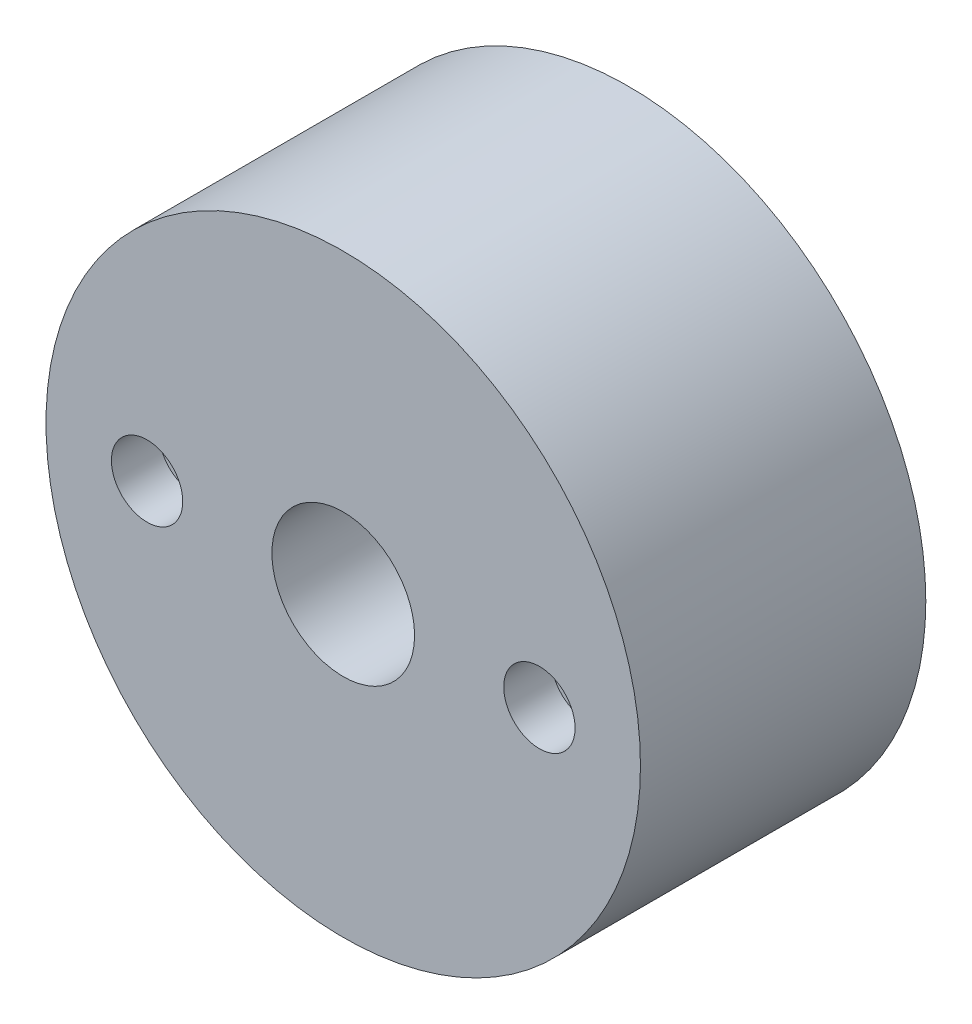
ISO-10303-21;
HEADER;
FILE_DESCRIPTION(('STEP AP214'),'2;1');
FILE_NAME('part.step','',(''),(''),'','','');
FILE_SCHEMA(('AUTOMOTIVE_DESIGN { 1 0 10303 214 1 1 1 1 }'));
ENDSEC;
DATA;
#1=APPLICATION_CONTEXT('core data for automotive mechanical design processes');
#2=APPLICATION_PROTOCOL_DEFINITION('international standard','automotive_design',2000,#1);
#3=PRODUCT_CONTEXT('',#1,'mechanical');
#4=PRODUCT('Part','Part','',(#3));
#5=PRODUCT_RELATED_PRODUCT_CATEGORY('part','',(#4));
#6=PRODUCT_DEFINITION_FORMATION('','',#4);
#7=PRODUCT_DEFINITION_CONTEXT('part definition',#1,'design');
#8=PRODUCT_DEFINITION('design','',#6,#7);
#9=PRODUCT_DEFINITION_SHAPE('','',#8);
#10=(LENGTH_UNIT() NAMED_UNIT(*) SI_UNIT(.MILLI.,.METRE.));
#11=(NAMED_UNIT(*) PLANE_ANGLE_UNIT() SI_UNIT($,.RADIAN.));
#12=(NAMED_UNIT(*) SI_UNIT($,.STERADIAN.) SOLID_ANGLE_UNIT());
#13=UNCERTAINTY_MEASURE_WITH_UNIT(LENGTH_MEASURE(1.E-05),#10,'distance_accuracy_value','');
#14=(GEOMETRIC_REPRESENTATION_CONTEXT(3) GLOBAL_UNCERTAINTY_ASSIGNED_CONTEXT((#13)) GLOBAL_UNIT_ASSIGNED_CONTEXT((#10,
#11,#12)) REPRESENTATION_CONTEXT('',''));
#15=CARTESIAN_POINT('',(0.,0.,0.));
#16=DIRECTION('',(0.,0.,1.));
#17=DIRECTION('',(1.,0.,0.));
#18=AXIS2_PLACEMENT_3D('',#15,#16,#17);
#19=CARTESIAN_POINT('',(0.,0.,12.));
#20=DIRECTION('',(0.,0.,-1.));
#21=DIRECTION('',(-1.,0.,0.));
#22=AXIS2_PLACEMENT_3D('',#19,#20,#21);
#23=CYLINDRICAL_SURFACE('',#22,12.5);
#24=CARTESIAN_POINT('',(0.,0.,12.));
#25=DIRECTION('',(0.,0.,1.));
#26=DIRECTION('',(1.,0.,0.));
#27=AXIS2_PLACEMENT_3D('',#24,#25,#26);
#28=CIRCLE('',#27,12.5);
#29=CARTESIAN_POINT('',(12.5,0.,12.));
#30=VERTEX_POINT('',#29);
#31=EDGE_CURVE('E10',#30,#30,#28,.T.);
#32=ORIENTED_EDGE('',*,*,#31,.F.);
#33=EDGE_LOOP('',(#32));
#34=FACE_BOUND('',#33,.T.);
#35=CARTESIAN_POINT('',(0.,0.,0.));
#36=DIRECTION('',(0.,0.,1.));
#37=DIRECTION('',(1.,0.,0.));
#38=AXIS2_PLACEMENT_3D('',#35,#36,#37);
#39=CIRCLE('',#38,12.5);
#40=CARTESIAN_POINT('',(12.5,0.,0.));
#41=VERTEX_POINT('',#40);
#42=EDGE_CURVE('E37',#41,#41,#39,.T.);
#43=ORIENTED_EDGE('',*,*,#42,.T.);
#44=EDGE_LOOP('',(#43));
#45=FACE_BOUND('',#44,.T.);
#46=ADVANCED_FACE('F34',(#34,#45),#23,.T.);
#47=CARTESIAN_POINT('',(0.,0.,12.));
#48=DIRECTION('',(0.,0.,1.));
#49=DIRECTION('',(1.,0.,0.));
#50=AXIS2_PLACEMENT_3D('',#47,#48,#49);
#51=PLANE('',#50);
#52=CARTESIAN_POINT('',(-8.25,0.,12.));
#53=DIRECTION('',(0.,0.,1.));
#54=DIRECTION('',(1.,0.,0.));
#55=AXIS2_PLACEMENT_3D('',#52,#53,#54);
#56=CIRCLE('',#55,1.5);
#57=CARTESIAN_POINT('',(-6.75,0.,12.));
#58=VERTEX_POINT('',#57);
#59=EDGE_CURVE('E58',#58,#58,#56,.T.);
#60=ORIENTED_EDGE('',*,*,#59,.F.);
#61=EDGE_LOOP('',(#60));
#62=FACE_BOUND('',#61,.T.);
#63=CARTESIAN_POINT('',(8.25,0.,12.));
#64=DIRECTION('',(0.,0.,1.));
#65=DIRECTION('',(1.,0.,0.));
#66=AXIS2_PLACEMENT_3D('',#63,#64,#65);
#67=CIRCLE('',#66,1.5);
#68=CARTESIAN_POINT('',(9.75,0.,12.));
#69=VERTEX_POINT('',#68);
#70=EDGE_CURVE('E52',#69,#69,#67,.T.);
#71=ORIENTED_EDGE('',*,*,#70,.F.);
#72=EDGE_LOOP('',(#71));
#73=FACE_BOUND('',#72,.T.);
#74=CARTESIAN_POINT('',(0.,0.,12.));
#75=DIRECTION('',(0.,0.,1.));
#76=DIRECTION('',(1.,0.,0.));
#77=AXIS2_PLACEMENT_3D('',#74,#75,#76);
#78=CIRCLE('',#77,3.);
#79=CARTESIAN_POINT('',(3.,0.,12.));
#80=VERTEX_POINT('',#79);
#81=EDGE_CURVE('E46',#80,#80,#78,.T.);
#82=ORIENTED_EDGE('',*,*,#81,.F.);
#83=EDGE_LOOP('',(#82));
#84=FACE_BOUND('',#83,.T.);
#85=ORIENTED_EDGE('',*,*,#31,.T.);
#86=EDGE_LOOP('',(#85));
#87=FACE_BOUND('',#86,.T.);
#88=ADVANCED_FACE('F73',(#62,#73,#84,#87),#51,.T.);
#89=CARTESIAN_POINT('',(0.,0.,0.));
#90=DIRECTION('',(0.,0.,1.));
#91=DIRECTION('',(1.,0.,0.));
#92=AXIS2_PLACEMENT_3D('',#89,#90,#91);
#93=PLANE('',#92);
#94=CARTESIAN_POINT('',(0.,0.,0.));
#95=DIRECTION('',(0.,0.,1.));
#96=DIRECTION('',(1.,0.,0.));
#97=AXIS2_PLACEMENT_3D('',#94,#95,#96);
#98=CIRCLE('',#97,3.);
#99=CARTESIAN_POINT('',(3.,0.,0.));
#100=VERTEX_POINT('',#99);
#101=EDGE_CURVE('E44',#100,#100,#98,.T.);
#102=ORIENTED_EDGE('',*,*,#101,.T.);
#103=EDGE_LOOP('',(#102));
#104=FACE_BOUND('',#103,.T.);
#105=ORIENTED_EDGE('',*,*,#42,.F.);
#106=EDGE_LOOP('',(#105));
#107=FACE_BOUND('',#106,.T.);
#108=ADVANCED_FACE('F76',(#104,#107),#93,.F.);
#109=CARTESIAN_POINT('',(0.,0.,0.));
#110=DIRECTION('',(0.,0.,1.));
#111=DIRECTION('',(1.,0.,0.));
#112=AXIS2_PLACEMENT_3D('',#109,#110,#111);
#113=CYLINDRICAL_SURFACE('',#112,3.);
#114=ORIENTED_EDGE('',*,*,#101,.F.);
#115=EDGE_LOOP('',(#114));
#116=FACE_BOUND('',#115,.T.);
#117=ORIENTED_EDGE('',*,*,#81,.T.);
#118=EDGE_LOOP('',(#117));
#119=FACE_BOUND('',#118,.T.);
#120=ADVANCED_FACE('F82',(#116,#119),#113,.F.);
#121=CARTESIAN_POINT('',(8.25,0.,10.));
#122=DIRECTION('',(0.,0.,1.));
#123=DIRECTION('',(1.,0.,0.));
#124=AXIS2_PLACEMENT_3D('',#121,#122,#123);
#125=CYLINDRICAL_SURFACE('',#124,1.5);
#126=CARTESIAN_POINT('',(8.25,0.,10.));
#127=DIRECTION('',(0.,0.,1.));
#128=DIRECTION('',(1.,0.,0.));
#129=AXIS2_PLACEMENT_3D('',#126,#127,#128);
#130=CIRCLE('',#129,1.5);
#131=CARTESIAN_POINT('',(9.75,0.,10.));
#132=VERTEX_POINT('',#131);
#133=EDGE_CURVE('E55',#132,#132,#130,.T.);
#134=ORIENTED_EDGE('',*,*,#133,.F.);
#135=EDGE_LOOP('',(#134));
#136=FACE_BOUND('',#135,.T.);
#137=ORIENTED_EDGE('',*,*,#70,.T.);
#138=EDGE_LOOP('',(#137));
#139=FACE_BOUND('',#138,.T.);
#140=ADVANCED_FACE('F84',(#136,#139),#125,.F.);
#141=CARTESIAN_POINT('',(8.25,0.,10.));
#142=DIRECTION('',(0.,0.,1.));
#143=DIRECTION('',(1.,0.,0.));
#144=AXIS2_PLACEMENT_3D('',#141,#142,#143);
#145=PLANE('',#144);
#146=ORIENTED_EDGE('',*,*,#133,.T.);
#147=EDGE_LOOP('',(#146));
#148=FACE_BOUND('',#147,.T.);
#149=ADVANCED_FACE('F69',(#148),#145,.T.);
#150=CARTESIAN_POINT('',(-8.25,0.,10.));
#151=DIRECTION('',(0.,0.,1.));
#152=DIRECTION('',(1.,0.,0.));
#153=AXIS2_PLACEMENT_3D('',#150,#151,#152);
#154=CYLINDRICAL_SURFACE('',#153,1.5);
#155=CARTESIAN_POINT('',(-8.25,0.,10.));
#156=DIRECTION('',(0.,0.,1.));
#157=DIRECTION('',(1.,0.,0.));
#158=AXIS2_PLACEMENT_3D('',#155,#156,#157);
#159=CIRCLE('',#158,1.5);
#160=CARTESIAN_POINT('',(-6.75,0.,10.));
#161=VERTEX_POINT('',#160);
#162=EDGE_CURVE('E49',#161,#161,#159,.T.);
#163=ORIENTED_EDGE('',*,*,#162,.F.);
#164=EDGE_LOOP('',(#163));
#165=FACE_BOUND('',#164,.T.);
#166=ORIENTED_EDGE('',*,*,#59,.T.);
#167=EDGE_LOOP('',(#166));
#168=FACE_BOUND('',#167,.T.);
#169=ADVANCED_FACE('F66',(#165,#168),#154,.F.);
#170=CARTESIAN_POINT('',(-8.25,0.,10.));
#171=DIRECTION('',(0.,0.,1.));
#172=DIRECTION('',(1.,0.,0.));
#173=AXIS2_PLACEMENT_3D('',#170,#171,#172);
#174=PLANE('',#173);
#175=ORIENTED_EDGE('',*,*,#162,.T.);
#176=EDGE_LOOP('',(#175));
#177=FACE_BOUND('',#176,.T.);
#178=ADVANCED_FACE('F64',(#177),#174,.T.);
#179=CLOSED_SHELL('',(#46,#88,#108,#120,#140,#149,#169,#178));
#180=MANIFOLD_SOLID_BREP('B2',#179);
#181=ADVANCED_BREP_SHAPE_REPRESENTATION('',(#18,#180),#14);
#182=SHAPE_DEFINITION_REPRESENTATION(#9,#181);
ENDSEC;
END-ISO-10303-21;
